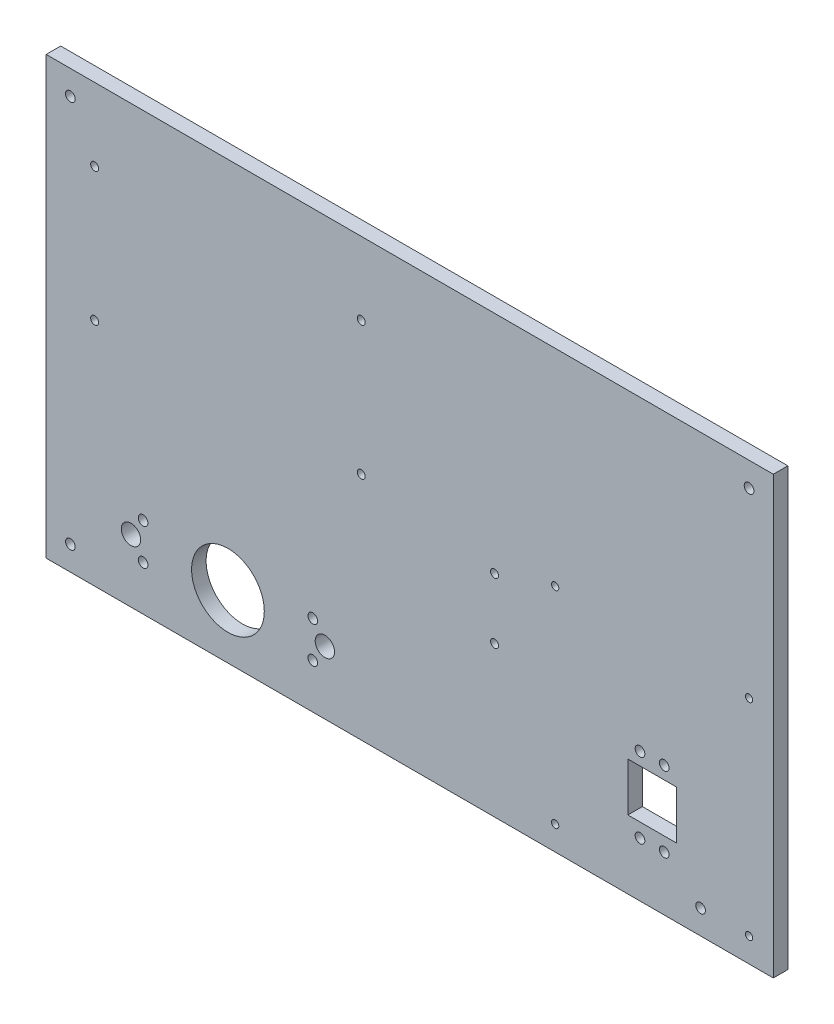
ISO-10303-21;
HEADER;
FILE_DESCRIPTION(('STEP AP214'),'2;1');
FILE_NAME('part.step','',(''),(''),'','','');
FILE_SCHEMA(('AUTOMOTIVE_DESIGN { 1 0 10303 214 1 1 1 1 }'));
ENDSEC;
DATA;
#1=APPLICATION_CONTEXT('core data for automotive mechanical design processes');
#2=APPLICATION_PROTOCOL_DEFINITION('international standard','automotive_design',2000,#1);
#3=PRODUCT_CONTEXT('',#1,'mechanical');
#4=PRODUCT('Part','Part','',(#3));
#5=PRODUCT_RELATED_PRODUCT_CATEGORY('part','',(#4));
#6=PRODUCT_DEFINITION_FORMATION('','',#4);
#7=PRODUCT_DEFINITION_CONTEXT('part definition',#1,'design');
#8=PRODUCT_DEFINITION('design','',#6,#7);
#9=PRODUCT_DEFINITION_SHAPE('','',#8);
#10=(LENGTH_UNIT() NAMED_UNIT(*) SI_UNIT(.MILLI.,.METRE.));
#11=(NAMED_UNIT(*) PLANE_ANGLE_UNIT() SI_UNIT($,.RADIAN.));
#12=(NAMED_UNIT(*) SI_UNIT($,.STERADIAN.) SOLID_ANGLE_UNIT());
#13=UNCERTAINTY_MEASURE_WITH_UNIT(LENGTH_MEASURE(1.E-05),#10,'distance_accuracy_value','');
#14=(GEOMETRIC_REPRESENTATION_CONTEXT(3) GLOBAL_UNCERTAINTY_ASSIGNED_CONTEXT((#13)) GLOBAL_UNIT_ASSIGNED_CONTEXT((#10,
#11,#12)) REPRESENTATION_CONTEXT('',''));
#15=CARTESIAN_POINT('',(0.,0.,0.));
#16=DIRECTION('',(0.,0.,1.));
#17=DIRECTION('',(1.,0.,0.));
#18=AXIS2_PLACEMENT_3D('',#15,#16,#17);
#19=CARTESIAN_POINT('',(0.,-41.75,6.));
#20=DIRECTION('',(0.,1.,0.));
#21=DIRECTION('',(0.,0.,1.));
#22=AXIS2_PLACEMENT_3D('',#19,#20,#21);
#23=PLANE('',#22);
#24=DIRECTION('',(1.,0.,0.));
#25=VECTOR('',#24,1.);
#26=CARTESIAN_POINT('',(0.,-41.75,0.));
#27=LINE('',#26,#25);
#28=CARTESIAN_POINT('',(90.,-41.75,0.));
#29=VERTEX_POINT('',#28);
#30=CARTESIAN_POINT('',(110.,-41.75,0.));
#31=VERTEX_POINT('',#30);
#32=EDGE_CURVE('E199',#29,#31,#27,.T.);
#33=ORIENTED_EDGE('',*,*,#32,.T.);
#34=DIRECTION('',(0.,0.,-1.));
#35=VECTOR('',#34,1.);
#36=CARTESIAN_POINT('',(110.,-41.75,6.));
#37=LINE('',#36,#35);
#38=CARTESIAN_POINT('',(110.,-41.75,6.));
#39=VERTEX_POINT('',#38);
#40=EDGE_CURVE('E11',#39,#31,#37,.T.);
#41=ORIENTED_EDGE('',*,*,#40,.F.);
#42=DIRECTION('',(1.,0.,0.));
#43=VECTOR('',#42,1.);
#44=CARTESIAN_POINT('',(0.,-41.75,6.));
#45=LINE('',#44,#43);
#46=CARTESIAN_POINT('',(90.,-41.75,6.));
#47=VERTEX_POINT('',#46);
#48=EDGE_CURVE('E118',#47,#39,#45,.T.);
#49=ORIENTED_EDGE('',*,*,#48,.F.);
#50=DIRECTION('',(0.,0.,-1.));
#51=VECTOR('',#50,1.);
#52=CARTESIAN_POINT('',(90.,-41.75,6.));
#53=LINE('',#52,#51);
#54=EDGE_CURVE('E56',#47,#29,#53,.T.);
#55=ORIENTED_EDGE('',*,*,#54,.T.);
#56=EDGE_LOOP('',(#33,#41,#49,#55));
#57=FACE_BOUND('',#56,.T.);
#58=ADVANCED_FACE('F37',(#57),#23,.F.);
#59=CARTESIAN_POINT('',(110.,0.,6.));
#60=DIRECTION('',(1.,0.,0.));
#61=DIRECTION('',(0.,1.,0.));
#62=AXIS2_PLACEMENT_3D('',#59,#60,#61);
#63=PLANE('',#62);
#64=DIRECTION('',(0.,-1.,0.));
#65=VECTOR('',#64,1.);
#66=CARTESIAN_POINT('',(110.,0.,0.));
#67=LINE('',#66,#65);
#68=CARTESIAN_POINT('',(110.,-61.75,0.));
#69=VERTEX_POINT('',#68);
#70=EDGE_CURVE('E124',#31,#69,#67,.T.);
#71=ORIENTED_EDGE('',*,*,#70,.T.);
#72=DIRECTION('',(0.,0.,-1.));
#73=VECTOR('',#72,1.);
#74=CARTESIAN_POINT('',(110.,-61.75,6.));
#75=LINE('',#74,#73);
#76=CARTESIAN_POINT('',(110.,-61.75,6.));
#77=VERTEX_POINT('',#76);
#78=EDGE_CURVE('E47',#77,#69,#75,.T.);
#79=ORIENTED_EDGE('',*,*,#78,.F.);
#80=DIRECTION('',(0.,-1.,0.));
#81=VECTOR('',#80,1.);
#82=CARTESIAN_POINT('',(110.,0.,6.));
#83=LINE('',#82,#81);
#84=EDGE_CURVE('E111',#39,#77,#83,.T.);
#85=ORIENTED_EDGE('',*,*,#84,.F.);
#86=ORIENTED_EDGE('',*,*,#40,.T.);
#87=EDGE_LOOP('',(#71,#79,#85,#86));
#88=FACE_BOUND('',#87,.T.);
#89=ADVANCED_FACE('F123',(#88),#63,.F.);
#90=CARTESIAN_POINT('',(0.,-61.75,6.));
#91=DIRECTION('',(0.,1.,0.));
#92=DIRECTION('',(0.,0.,1.));
#93=AXIS2_PLACEMENT_3D('',#90,#91,#92);
#94=PLANE('',#93);
#95=DIRECTION('',(1.,0.,0.));
#96=VECTOR('',#95,1.);
#97=CARTESIAN_POINT('',(0.,-61.75,0.));
#98=LINE('',#97,#96);
#99=CARTESIAN_POINT('',(90.,-61.75,0.));
#100=VERTEX_POINT('',#99);
#101=EDGE_CURVE('E202',#100,#69,#98,.T.);
#102=ORIENTED_EDGE('',*,*,#101,.F.);
#103=DIRECTION('',(0.,0.,-1.));
#104=VECTOR('',#103,1.);
#105=CARTESIAN_POINT('',(90.,-61.75,6.));
#106=LINE('',#105,#104);
#107=CARTESIAN_POINT('',(90.,-61.75,6.));
#108=VERTEX_POINT('',#107);
#109=EDGE_CURVE('E82',#108,#100,#106,.T.);
#110=ORIENTED_EDGE('',*,*,#109,.F.);
#111=DIRECTION('',(1.,0.,0.));
#112=VECTOR('',#111,1.);
#113=CARTESIAN_POINT('',(0.,-61.75,6.));
#114=LINE('',#113,#112);
#115=EDGE_CURVE('E117',#108,#77,#114,.T.);
#116=ORIENTED_EDGE('',*,*,#115,.T.);
#117=ORIENTED_EDGE('',*,*,#78,.T.);
#118=EDGE_LOOP('',(#102,#110,#116,#117));
#119=FACE_BOUND('',#118,.T.);
#120=ADVANCED_FACE('F128',(#119),#94,.T.);
#121=CARTESIAN_POINT('',(150.,0.,6.));
#122=DIRECTION('',(1.,0.,0.));
#123=DIRECTION('',(0.,1.,0.));
#124=AXIS2_PLACEMENT_3D('',#121,#122,#123);
#125=PLANE('',#124);
#126=DIRECTION('',(0.,-1.,0.));
#127=VECTOR('',#126,1.);
#128=CARTESIAN_POINT('',(150.,0.,0.));
#129=LINE('',#128,#127);
#130=CARTESIAN_POINT('',(150.,89.9999999999999,0.));
#131=VERTEX_POINT('',#130);
#132=CARTESIAN_POINT('',(150.,-89.9999999999999,0.));
#133=VERTEX_POINT('',#132);
#134=EDGE_CURVE('E187',#131,#133,#129,.T.);
#135=ORIENTED_EDGE('',*,*,#134,.F.);
#136=DIRECTION('',(0.,0.,-1.));
#137=VECTOR('',#136,1.);
#138=CARTESIAN_POINT('',(150.,89.9999999999999,6.));
#139=LINE('',#138,#137);
#140=CARTESIAN_POINT('',(150.,89.9999999999999,6.));
#141=VERTEX_POINT('',#140);
#142=EDGE_CURVE('E94',#141,#131,#139,.T.);
#143=ORIENTED_EDGE('',*,*,#142,.F.);
#144=DIRECTION('',(0.,-1.,0.));
#145=VECTOR('',#144,1.);
#146=CARTESIAN_POINT('',(150.,0.,6.));
#147=LINE('',#146,#145);
#148=CARTESIAN_POINT('',(150.,-89.9999999999999,6.));
#149=VERTEX_POINT('',#148);
#150=EDGE_CURVE('E312',#141,#149,#147,.T.);
#151=ORIENTED_EDGE('',*,*,#150,.T.);
#152=DIRECTION('',(0.,0.,-1.));
#153=VECTOR('',#152,1.);
#154=CARTESIAN_POINT('',(150.,-89.9999999999999,6.));
#155=LINE('',#154,#153);
#156=EDGE_CURVE('E137',#149,#133,#155,.T.);
#157=ORIENTED_EDGE('',*,*,#156,.T.);
#158=EDGE_LOOP('',(#135,#143,#151,#157));
#159=FACE_BOUND('',#158,.T.);
#160=ADVANCED_FACE('F328',(#159),#125,.T.);
#161=CARTESIAN_POINT('',(0.,90.,6.));
#162=DIRECTION('',(0.,1.,0.));
#163=DIRECTION('',(-1.,0.,0.));
#164=AXIS2_PLACEMENT_3D('',#161,#162,#163);
#165=PLANE('',#164);
#166=DIRECTION('',(1.,0.,0.));
#167=VECTOR('',#166,1.);
#168=CARTESIAN_POINT('',(0.,90.,0.));
#169=LINE('',#168,#167);
#170=CARTESIAN_POINT('',(-150.,90.,0.));
#171=VERTEX_POINT('',#170);
#172=EDGE_CURVE('E190',#171,#131,#169,.T.);
#173=ORIENTED_EDGE('',*,*,#172,.F.);
#174=DIRECTION('',(0.,0.,-1.));
#175=VECTOR('',#174,1.);
#176=CARTESIAN_POINT('',(-150.,90.,6.));
#177=LINE('',#176,#175);
#178=CARTESIAN_POINT('',(-150.,90.,6.));
#179=VERTEX_POINT('',#178);
#180=EDGE_CURVE('E217',#179,#171,#177,.T.);
#181=ORIENTED_EDGE('',*,*,#180,.F.);
#182=DIRECTION('',(1.,0.,0.));
#183=VECTOR('',#182,1.);
#184=CARTESIAN_POINT('',(0.,90.,6.));
#185=LINE('',#184,#183);
#186=EDGE_CURVE('E314',#179,#141,#185,.T.);
#187=ORIENTED_EDGE('',*,*,#186,.T.);
#188=ORIENTED_EDGE('',*,*,#142,.T.);
#189=EDGE_LOOP('',(#173,#181,#187,#188));
#190=FACE_BOUND('',#189,.T.);
#191=ADVANCED_FACE('F330',(#190),#165,.T.);
#192=CARTESIAN_POINT('',(-150.,0.,6.));
#193=DIRECTION('',(1.,0.,0.));
#194=DIRECTION('',(0.,1.,0.));
#195=AXIS2_PLACEMENT_3D('',#192,#193,#194);
#196=PLANE('',#195);
#197=DIRECTION('',(0.,-1.,0.));
#198=VECTOR('',#197,1.);
#199=CARTESIAN_POINT('',(-150.,0.,0.));
#200=LINE('',#199,#198);
#201=CARTESIAN_POINT('',(-150.,-90.,0.));
#202=VERTEX_POINT('',#201);
#203=EDGE_CURVE('E193',#171,#202,#200,.T.);
#204=ORIENTED_EDGE('',*,*,#203,.T.);
#205=DIRECTION('',(0.,0.,-1.));
#206=VECTOR('',#205,1.);
#207=CARTESIAN_POINT('',(-150.,-90.,6.));
#208=LINE('',#207,#206);
#209=CARTESIAN_POINT('',(-150.,-90.,6.));
#210=VERTEX_POINT('',#209);
#211=EDGE_CURVE('E214',#210,#202,#208,.T.);
#212=ORIENTED_EDGE('',*,*,#211,.F.);
#213=DIRECTION('',(0.,-1.,0.));
#214=VECTOR('',#213,1.);
#215=CARTESIAN_POINT('',(-150.,0.,6.));
#216=LINE('',#215,#214);
#217=EDGE_CURVE('E317',#179,#210,#216,.T.);
#218=ORIENTED_EDGE('',*,*,#217,.F.);
#219=ORIENTED_EDGE('',*,*,#180,.T.);
#220=EDGE_LOOP('',(#204,#212,#218,#219));
#221=FACE_BOUND('',#220,.T.);
#222=ADVANCED_FACE('F336',(#221),#196,.F.);
#223=CARTESIAN_POINT('',(90.,0.,6.));
#224=DIRECTION('',(1.,0.,0.));
#225=DIRECTION('',(0.,0.,-1.));
#226=AXIS2_PLACEMENT_3D('',#223,#224,#225);
#227=PLANE('',#226);
#228=DIRECTION('',(0.,-1.,0.));
#229=VECTOR('',#228,1.);
#230=CARTESIAN_POINT('',(90.,0.,0.));
#231=LINE('',#230,#229);
#232=EDGE_CURVE('E204',#29,#100,#231,.T.);
#233=ORIENTED_EDGE('',*,*,#232,.F.);
#234=ORIENTED_EDGE('',*,*,#54,.F.);
#235=DIRECTION('',(0.,-1.,0.));
#236=VECTOR('',#235,1.);
#237=CARTESIAN_POINT('',(90.,0.,6.));
#238=LINE('',#237,#236);
#239=EDGE_CURVE('E129',#47,#108,#238,.T.);
#240=ORIENTED_EDGE('',*,*,#239,.T.);
#241=ORIENTED_EDGE('',*,*,#109,.T.);
#242=EDGE_LOOP('',(#233,#234,#240,#241));
#243=FACE_BOUND('',#242,.T.);
#244=ADVANCED_FACE('F351',(#243),#227,.T.);
#245=CARTESIAN_POINT('',(0.,-90.,6.));
#246=DIRECTION('',(0.,1.,0.));
#247=DIRECTION('',(-1.,0.,0.));
#248=AXIS2_PLACEMENT_3D('',#245,#246,#247);
#249=PLANE('',#248);
#250=DIRECTION('',(1.,0.,0.));
#251=VECTOR('',#250,1.);
#252=CARTESIAN_POINT('',(0.,-90.,0.));
#253=LINE('',#252,#251);
#254=EDGE_CURVE('E196',#202,#133,#253,.T.);
#255=ORIENTED_EDGE('',*,*,#254,.T.);
#256=ORIENTED_EDGE('',*,*,#156,.F.);
#257=DIRECTION('',(1.,0.,0.));
#258=VECTOR('',#257,1.);
#259=CARTESIAN_POINT('',(0.,-90.,6.));
#260=LINE('',#259,#258);
#261=EDGE_CURVE('E320',#210,#149,#260,.T.);
#262=ORIENTED_EDGE('',*,*,#261,.F.);
#263=ORIENTED_EDGE('',*,*,#211,.T.);
#264=EDGE_LOOP('',(#255,#256,#262,#263));
#265=FACE_BOUND('',#264,.T.);
#266=ADVANCED_FACE('F327',(#265),#249,.F.);
#267=CARTESIAN_POINT('',(140.,4.99999999999997,6.));
#268=DIRECTION('',(0.,0.,-1.));
#269=DIRECTION('',(-1.,0.,0.));
#270=AXIS2_PLACEMENT_3D('',#267,#268,#269);
#271=CYLINDRICAL_SURFACE('',#270,1.5);
#272=CARTESIAN_POINT('',(140.,4.99999999999997,6.));
#273=DIRECTION('',(0.,0.,1.));
#274=DIRECTION('',(1.,0.,0.));
#275=AXIS2_PLACEMENT_3D('',#272,#273,#274);
#276=CIRCLE('',#275,1.5);
#277=CARTESIAN_POINT('',(141.5,4.99999999999997,6.));
#278=VERTEX_POINT('',#277);
#279=EDGE_CURVE('E309',#278,#278,#276,.T.);
#280=ORIENTED_EDGE('',*,*,#279,.T.);
#281=EDGE_LOOP('',(#280));
#282=FACE_BOUND('',#281,.T.);
#283=CARTESIAN_POINT('',(140.,4.99999999999997,0.));
#284=DIRECTION('',(0.,0.,1.));
#285=DIRECTION('',(1.,0.,0.));
#286=AXIS2_PLACEMENT_3D('',#283,#284,#285);
#287=CIRCLE('',#286,1.5);
#288=CARTESIAN_POINT('',(141.5,4.99999999999997,0.));
#289=VERTEX_POINT('',#288);
#290=EDGE_CURVE('E184',#289,#289,#287,.T.);
#291=ORIENTED_EDGE('',*,*,#290,.F.);
#292=EDGE_LOOP('',(#291));
#293=FACE_BOUND('',#292,.T.);
#294=ADVANCED_FACE('F350',(#282,#293),#271,.F.);
#295=CARTESIAN_POINT('',(140.,-80.,6.));
#296=DIRECTION('',(0.,0.,-1.));
#297=DIRECTION('',(-1.,0.,0.));
#298=AXIS2_PLACEMENT_3D('',#295,#296,#297);
#299=CYLINDRICAL_SURFACE('',#298,1.5);
#300=CARTESIAN_POINT('',(140.,-80.,6.));
#301=DIRECTION('',(0.,0.,1.));
#302=DIRECTION('',(1.,0.,0.));
#303=AXIS2_PLACEMENT_3D('',#300,#301,#302);
#304=CIRCLE('',#303,1.5);
#305=CARTESIAN_POINT('',(141.5,-80.,6.));
#306=VERTEX_POINT('',#305);
#307=EDGE_CURVE('E306',#306,#306,#304,.F.);
#308=ORIENTED_EDGE('',*,*,#307,.F.);
#309=EDGE_LOOP('',(#308));
#310=FACE_BOUND('',#309,.T.);
#311=CARTESIAN_POINT('',(140.,-80.,0.));
#312=DIRECTION('',(0.,0.,1.));
#313=DIRECTION('',(1.,0.,0.));
#314=AXIS2_PLACEMENT_3D('',#311,#312,#313);
#315=CIRCLE('',#314,1.5);
#316=CARTESIAN_POINT('',(141.5,-80.,0.));
#317=VERTEX_POINT('',#316);
#318=EDGE_CURVE('E181',#317,#317,#315,.F.);
#319=ORIENTED_EDGE('',*,*,#318,.T.);
#320=EDGE_LOOP('',(#319));
#321=FACE_BOUND('',#320,.T.);
#322=ADVANCED_FACE('F469',(#310,#321),#299,.F.);
#323=CARTESIAN_POINT('',(60.,4.99999999999995,6.));
#324=DIRECTION('',(0.,0.,-1.));
#325=DIRECTION('',(-1.,0.,0.));
#326=AXIS2_PLACEMENT_3D('',#323,#324,#325);
#327=CYLINDRICAL_SURFACE('',#326,1.5);
#328=CARTESIAN_POINT('',(60.,4.99999999999995,6.));
#329=DIRECTION('',(0.,0.,1.));
#330=DIRECTION('',(1.,0.,0.));
#331=AXIS2_PLACEMENT_3D('',#328,#329,#330);
#332=CIRCLE('',#331,1.5);
#333=CARTESIAN_POINT('',(61.5,4.99999999999995,6.));
#334=VERTEX_POINT('',#333);
#335=EDGE_CURVE('E303',#334,#334,#332,.T.);
#336=ORIENTED_EDGE('',*,*,#335,.T.);
#337=EDGE_LOOP('',(#336));
#338=FACE_BOUND('',#337,.T.);
#339=CARTESIAN_POINT('',(60.,4.99999999999995,0.));
#340=DIRECTION('',(0.,0.,1.));
#341=DIRECTION('',(1.,0.,0.));
#342=AXIS2_PLACEMENT_3D('',#339,#340,#341);
#343=CIRCLE('',#342,1.5);
#344=CARTESIAN_POINT('',(61.5,4.99999999999995,0.));
#345=VERTEX_POINT('',#344);
#346=EDGE_CURVE('E178',#345,#345,#343,.T.);
#347=ORIENTED_EDGE('',*,*,#346,.F.);
#348=EDGE_LOOP('',(#347));
#349=FACE_BOUND('',#348,.T.);
#350=ADVANCED_FACE('F475',(#338,#349),#327,.F.);
#351=CARTESIAN_POINT('',(-110.,-56.5,6.));
#352=DIRECTION('',(0.,0.,-1.));
#353=DIRECTION('',(-1.,0.,0.));
#354=AXIS2_PLACEMENT_3D('',#351,#352,#353);
#355=CYLINDRICAL_SURFACE('',#354,2.);
#356=CARTESIAN_POINT('',(-110.,-56.5,6.));
#357=DIRECTION('',(0.,0.,1.));
#358=DIRECTION('',(1.,0.,0.));
#359=AXIS2_PLACEMENT_3D('',#356,#357,#358);
#360=CIRCLE('',#359,2.);
#361=CARTESIAN_POINT('',(-108.,-56.5,6.));
#362=VERTEX_POINT('',#361);
#363=EDGE_CURVE('E300',#362,#362,#360,.T.);
#364=ORIENTED_EDGE('',*,*,#363,.T.);
#365=EDGE_LOOP('',(#364));
#366=FACE_BOUND('',#365,.T.);
#367=CARTESIAN_POINT('',(-110.,-56.5,0.));
#368=DIRECTION('',(0.,0.,1.));
#369=DIRECTION('',(1.,0.,0.));
#370=AXIS2_PLACEMENT_3D('',#367,#368,#369);
#371=CIRCLE('',#370,2.);
#372=CARTESIAN_POINT('',(-108.,-56.5,0.));
#373=VERTEX_POINT('',#372);
#374=EDGE_CURVE('E175',#373,#373,#371,.T.);
#375=ORIENTED_EDGE('',*,*,#374,.F.);
#376=EDGE_LOOP('',(#375));
#377=FACE_BOUND('',#376,.T.);
#378=ADVANCED_FACE('F481',(#366,#377),#355,.F.);
#379=CARTESIAN_POINT('',(-39.9999999999999,-56.5,6.));
#380=DIRECTION('',(0.,0.,-1.));
#381=DIRECTION('',(-1.,0.,0.));
#382=AXIS2_PLACEMENT_3D('',#379,#380,#381);
#383=CYLINDRICAL_SURFACE('',#382,2.);
#384=CARTESIAN_POINT('',(-39.9999999999999,-56.5,6.));
#385=DIRECTION('',(0.,0.,1.));
#386=DIRECTION('',(1.,0.,0.));
#387=AXIS2_PLACEMENT_3D('',#384,#385,#386);
#388=CIRCLE('',#387,2.);
#389=CARTESIAN_POINT('',(-37.9999999999999,-56.5,6.));
#390=VERTEX_POINT('',#389);
#391=EDGE_CURVE('E297',#390,#390,#388,.T.);
#392=ORIENTED_EDGE('',*,*,#391,.T.);
#393=EDGE_LOOP('',(#392));
#394=FACE_BOUND('',#393,.T.);
#395=CARTESIAN_POINT('',(-39.9999999999999,-56.5,0.));
#396=DIRECTION('',(0.,0.,1.));
#397=DIRECTION('',(1.,0.,0.));
#398=AXIS2_PLACEMENT_3D('',#395,#396,#397);
#399=CIRCLE('',#398,2.);
#400=CARTESIAN_POINT('',(-37.9999999999999,-56.5,0.));
#401=VERTEX_POINT('',#400);
#402=EDGE_CURVE('E172',#401,#401,#399,.T.);
#403=ORIENTED_EDGE('',*,*,#402,.F.);
#404=EDGE_LOOP('',(#403));
#405=FACE_BOUND('',#404,.T.);
#406=ADVANCED_FACE('F485',(#394,#405),#383,.F.);
#407=CARTESIAN_POINT('',(-74.9999999999999,-64.,6.));
#408=DIRECTION('',(0.,0.,-1.));
#409=DIRECTION('',(-1.,0.,0.));
#410=AXIS2_PLACEMENT_3D('',#407,#408,#409);
#411=CYLINDRICAL_SURFACE('',#410,15.);
#412=CARTESIAN_POINT('',(-74.9999999999999,-64.,6.));
#413=DIRECTION('',(0.,0.,1.));
#414=DIRECTION('',(1.,0.,0.));
#415=AXIS2_PLACEMENT_3D('',#412,#413,#414);
#416=CIRCLE('',#415,15.);
#417=CARTESIAN_POINT('',(-59.9999999999999,-64.,6.));
#418=VERTEX_POINT('',#417);
#419=EDGE_CURVE('E294',#418,#418,#416,.T.);
#420=ORIENTED_EDGE('',*,*,#419,.T.);
#421=EDGE_LOOP('',(#420));
#422=FACE_BOUND('',#421,.T.);
#423=CARTESIAN_POINT('',(-74.9999999999999,-64.,0.));
#424=DIRECTION('',(0.,0.,1.));
#425=DIRECTION('',(1.,0.,0.));
#426=AXIS2_PLACEMENT_3D('',#423,#424,#425);
#427=CIRCLE('',#426,15.);
#428=CARTESIAN_POINT('',(-59.9999999999999,-64.,0.));
#429=VERTEX_POINT('',#428);
#430=EDGE_CURVE('E169',#429,#429,#427,.T.);
#431=ORIENTED_EDGE('',*,*,#430,.F.);
#432=EDGE_LOOP('',(#431));
#433=FACE_BOUND('',#432,.T.);
#434=ADVANCED_FACE('F489',(#422,#433),#411,.F.);
#435=CARTESIAN_POINT('',(-34.9999999999999,-64.,6.));
#436=DIRECTION('',(0.,0.,-1.));
#437=DIRECTION('',(-1.,0.,0.));
#438=AXIS2_PLACEMENT_3D('',#435,#436,#437);
#439=CYLINDRICAL_SURFACE('',#438,4.);
#440=CARTESIAN_POINT('',(-34.9999999999999,-64.,6.));
#441=DIRECTION('',(0.,0.,1.));
#442=DIRECTION('',(1.,0.,0.));
#443=AXIS2_PLACEMENT_3D('',#440,#441,#442);
#444=CIRCLE('',#443,4.);
#445=CARTESIAN_POINT('',(-30.9999999999999,-64.,6.));
#446=VERTEX_POINT('',#445);
#447=EDGE_CURVE('E291',#446,#446,#444,.T.);
#448=ORIENTED_EDGE('',*,*,#447,.T.);
#449=EDGE_LOOP('',(#448));
#450=FACE_BOUND('',#449,.T.);
#451=CARTESIAN_POINT('',(-34.9999999999999,-64.,0.));
#452=DIRECTION('',(0.,0.,1.));
#453=DIRECTION('',(1.,0.,0.));
#454=AXIS2_PLACEMENT_3D('',#451,#452,#453);
#455=CIRCLE('',#454,4.);
#456=CARTESIAN_POINT('',(-30.9999999999999,-64.,0.));
#457=VERTEX_POINT('',#456);
#458=EDGE_CURVE('E166',#457,#457,#455,.T.);
#459=ORIENTED_EDGE('',*,*,#458,.F.);
#460=EDGE_LOOP('',(#459));
#461=FACE_BOUND('',#460,.T.);
#462=ADVANCED_FACE('F493',(#450,#461),#439,.F.);
#463=CARTESIAN_POINT('',(-115.,-64.0000000000001,6.));
#464=DIRECTION('',(0.,0.,-1.));
#465=DIRECTION('',(-1.,0.,0.));
#466=AXIS2_PLACEMENT_3D('',#463,#464,#465);
#467=CYLINDRICAL_SURFACE('',#466,4.00000000000001);
#468=CARTESIAN_POINT('',(-115.,-64.0000000000001,6.));
#469=DIRECTION('',(0.,0.,1.));
#470=DIRECTION('',(1.,0.,0.));
#471=AXIS2_PLACEMENT_3D('',#468,#469,#470);
#472=CIRCLE('',#471,4.00000000000001);
#473=CARTESIAN_POINT('',(-111.,-64.0000000000001,6.));
#474=VERTEX_POINT('',#473);
#475=EDGE_CURVE('E288',#474,#474,#472,.T.);
#476=ORIENTED_EDGE('',*,*,#475,.T.);
#477=EDGE_LOOP('',(#476));
#478=FACE_BOUND('',#477,.T.);
#479=CARTESIAN_POINT('',(-115.,-64.0000000000001,0.));
#480=DIRECTION('',(0.,0.,1.));
#481=DIRECTION('',(1.,0.,0.));
#482=AXIS2_PLACEMENT_3D('',#479,#480,#481);
#483=CIRCLE('',#482,4.00000000000001);
#484=CARTESIAN_POINT('',(-111.,-64.0000000000001,0.));
#485=VERTEX_POINT('',#484);
#486=EDGE_CURVE('E163',#485,#485,#483,.T.);
#487=ORIENTED_EDGE('',*,*,#486,.F.);
#488=EDGE_LOOP('',(#487));
#489=FACE_BOUND('',#488,.T.);
#490=ADVANCED_FACE('F497',(#478,#489),#467,.F.);
#491=CARTESIAN_POINT('',(-39.9999999999999,-71.5,6.));
#492=DIRECTION('',(0.,0.,-1.));
#493=DIRECTION('',(-1.,0.,0.));
#494=AXIS2_PLACEMENT_3D('',#491,#492,#493);
#495=CYLINDRICAL_SURFACE('',#494,2.);
#496=CARTESIAN_POINT('',(-39.9999999999999,-71.5,6.));
#497=DIRECTION('',(0.,0.,1.));
#498=DIRECTION('',(1.,0.,0.));
#499=AXIS2_PLACEMENT_3D('',#496,#497,#498);
#500=CIRCLE('',#499,2.);
#501=CARTESIAN_POINT('',(-37.9999999999999,-71.5,6.));
#502=VERTEX_POINT('',#501);
#503=EDGE_CURVE('E285',#502,#502,#500,.T.);
#504=ORIENTED_EDGE('',*,*,#503,.T.);
#505=EDGE_LOOP('',(#504));
#506=FACE_BOUND('',#505,.T.);
#507=CARTESIAN_POINT('',(-39.9999999999999,-71.5,0.));
#508=DIRECTION('',(0.,0.,1.));
#509=DIRECTION('',(1.,0.,0.));
#510=AXIS2_PLACEMENT_3D('',#507,#508,#509);
#511=CIRCLE('',#510,2.);
#512=CARTESIAN_POINT('',(-37.9999999999999,-71.5,0.));
#513=VERTEX_POINT('',#512);
#514=EDGE_CURVE('E160',#513,#513,#511,.T.);
#515=ORIENTED_EDGE('',*,*,#514,.F.);
#516=EDGE_LOOP('',(#515));
#517=FACE_BOUND('',#516,.T.);
#518=ADVANCED_FACE('F501',(#506,#517),#495,.F.);
#519=CARTESIAN_POINT('',(-110.,-71.5,6.));
#520=DIRECTION('',(0.,0.,-1.));
#521=DIRECTION('',(-1.,0.,0.));
#522=AXIS2_PLACEMENT_3D('',#519,#520,#521);
#523=CYLINDRICAL_SURFACE('',#522,2.);
#524=CARTESIAN_POINT('',(-110.,-71.5,6.));
#525=DIRECTION('',(0.,0.,1.));
#526=DIRECTION('',(1.,0.,0.));
#527=AXIS2_PLACEMENT_3D('',#524,#525,#526);
#528=CIRCLE('',#527,2.);
#529=CARTESIAN_POINT('',(-108.,-71.5,6.));
#530=VERTEX_POINT('',#529);
#531=EDGE_CURVE('E282',#530,#530,#528,.T.);
#532=ORIENTED_EDGE('',*,*,#531,.T.);
#533=EDGE_LOOP('',(#532));
#534=FACE_BOUND('',#533,.T.);
#535=CARTESIAN_POINT('',(-110.,-71.5,0.));
#536=DIRECTION('',(0.,0.,1.));
#537=DIRECTION('',(1.,0.,0.));
#538=AXIS2_PLACEMENT_3D('',#535,#536,#537);
#539=CIRCLE('',#538,2.);
#540=CARTESIAN_POINT('',(-108.,-71.5,0.));
#541=VERTEX_POINT('',#540);
#542=EDGE_CURVE('E157',#541,#541,#539,.T.);
#543=ORIENTED_EDGE('',*,*,#542,.F.);
#544=EDGE_LOOP('',(#543));
#545=FACE_BOUND('',#544,.T.);
#546=ADVANCED_FACE('F505',(#534,#545),#523,.F.);
#547=CARTESIAN_POINT('',(35.,-3.00000000000004,6.));
#548=DIRECTION('',(0.,0.,-1.));
#549=DIRECTION('',(-1.,0.,0.));
#550=AXIS2_PLACEMENT_3D('',#547,#548,#549);
#551=CYLINDRICAL_SURFACE('',#550,1.65);
#552=CARTESIAN_POINT('',(35.,-3.00000000000004,6.));
#553=DIRECTION('',(0.,0.,1.));
#554=DIRECTION('',(1.,0.,0.));
#555=AXIS2_PLACEMENT_3D('',#552,#553,#554);
#556=CIRCLE('',#555,1.65);
#557=CARTESIAN_POINT('',(36.65,-3.00000000000004,6.));
#558=VERTEX_POINT('',#557);
#559=EDGE_CURVE('E279',#558,#558,#556,.T.);
#560=ORIENTED_EDGE('',*,*,#559,.T.);
#561=EDGE_LOOP('',(#560));
#562=FACE_BOUND('',#561,.T.);
#563=CARTESIAN_POINT('',(35.,-3.00000000000004,0.));
#564=DIRECTION('',(0.,0.,1.));
#565=DIRECTION('',(1.,0.,0.));
#566=AXIS2_PLACEMENT_3D('',#563,#564,#565);
#567=CIRCLE('',#566,1.65);
#568=CARTESIAN_POINT('',(36.65,-3.00000000000004,0.));
#569=VERTEX_POINT('',#568);
#570=EDGE_CURVE('E154',#569,#569,#567,.T.);
#571=ORIENTED_EDGE('',*,*,#570,.F.);
#572=EDGE_LOOP('',(#571));
#573=FACE_BOUND('',#572,.T.);
#574=ADVANCED_FACE('F509',(#562,#573),#551,.F.);
#575=CARTESIAN_POINT('',(35.,-28.,6.));
#576=DIRECTION('',(0.,0.,-1.));
#577=DIRECTION('',(-1.,0.,0.));
#578=AXIS2_PLACEMENT_3D('',#575,#576,#577);
#579=CYLINDRICAL_SURFACE('',#578,1.65);
#580=CARTESIAN_POINT('',(35.,-28.,6.));
#581=DIRECTION('',(0.,0.,1.));
#582=DIRECTION('',(1.,0.,0.));
#583=AXIS2_PLACEMENT_3D('',#580,#581,#582);
#584=CIRCLE('',#583,1.65);
#585=CARTESIAN_POINT('',(36.65,-28.,6.));
#586=VERTEX_POINT('',#585);
#587=EDGE_CURVE('E276',#586,#586,#584,.T.);
#588=ORIENTED_EDGE('',*,*,#587,.T.);
#589=EDGE_LOOP('',(#588));
#590=FACE_BOUND('',#589,.T.);
#591=CARTESIAN_POINT('',(35.,-28.,0.));
#592=DIRECTION('',(0.,0.,1.));
#593=DIRECTION('',(1.,0.,0.));
#594=AXIS2_PLACEMENT_3D('',#591,#592,#593);
#595=CIRCLE('',#594,1.65);
#596=CARTESIAN_POINT('',(36.65,-28.,0.));
#597=VERTEX_POINT('',#596);
#598=EDGE_CURVE('E151',#597,#597,#595,.T.);
#599=ORIENTED_EDGE('',*,*,#598,.F.);
#600=EDGE_LOOP('',(#599));
#601=FACE_BOUND('',#600,.T.);
#602=ADVANCED_FACE('F513',(#590,#601),#579,.F.);
#603=CARTESIAN_POINT('',(-130.,59.9999999999999,6.));
#604=DIRECTION('',(0.,0.,-1.));
#605=DIRECTION('',(-1.,0.,0.));
#606=AXIS2_PLACEMENT_3D('',#603,#604,#605);
#607=CYLINDRICAL_SURFACE('',#606,1.64999999999999);
#608=CARTESIAN_POINT('',(-130.,59.9999999999999,6.));
#609=DIRECTION('',(0.,0.,1.));
#610=DIRECTION('',(1.,0.,0.));
#611=AXIS2_PLACEMENT_3D('',#608,#609,#610);
#612=CIRCLE('',#611,1.64999999999999);
#613=CARTESIAN_POINT('',(-128.35,59.9999999999999,6.));
#614=VERTEX_POINT('',#613);
#615=EDGE_CURVE('E273',#614,#614,#612,.T.);
#616=ORIENTED_EDGE('',*,*,#615,.T.);
#617=EDGE_LOOP('',(#616));
#618=FACE_BOUND('',#617,.T.);
#619=CARTESIAN_POINT('',(-130.,59.9999999999999,0.));
#620=DIRECTION('',(0.,0.,1.));
#621=DIRECTION('',(1.,0.,0.));
#622=AXIS2_PLACEMENT_3D('',#619,#620,#621);
#623=CIRCLE('',#622,1.64999999999999);
#624=CARTESIAN_POINT('',(-128.35,59.9999999999999,0.));
#625=VERTEX_POINT('',#624);
#626=EDGE_CURVE('E148',#625,#625,#623,.T.);
#627=ORIENTED_EDGE('',*,*,#626,.F.);
#628=EDGE_LOOP('',(#627));
#629=FACE_BOUND('',#628,.T.);
#630=ADVANCED_FACE('F517',(#618,#629),#607,.F.);
#631=CARTESIAN_POINT('',(-20.,60.,6.));
#632=DIRECTION('',(0.,0.,-1.));
#633=DIRECTION('',(-1.,0.,0.));
#634=AXIS2_PLACEMENT_3D('',#631,#632,#633);
#635=CYLINDRICAL_SURFACE('',#634,1.65000000000001);
#636=CARTESIAN_POINT('',(-20.,60.,6.));
#637=DIRECTION('',(0.,0.,1.));
#638=DIRECTION('',(1.,0.,0.));
#639=AXIS2_PLACEMENT_3D('',#636,#637,#638);
#640=CIRCLE('',#639,1.65000000000001);
#641=CARTESIAN_POINT('',(-18.35,60.,6.));
#642=VERTEX_POINT('',#641);
#643=EDGE_CURVE('E270',#642,#642,#640,.T.);
#644=ORIENTED_EDGE('',*,*,#643,.T.);
#645=EDGE_LOOP('',(#644));
#646=FACE_BOUND('',#645,.T.);
#647=CARTESIAN_POINT('',(-20.,60.,0.));
#648=DIRECTION('',(0.,0.,1.));
#649=DIRECTION('',(1.,0.,0.));
#650=AXIS2_PLACEMENT_3D('',#647,#648,#649);
#651=CIRCLE('',#650,1.65000000000001);
#652=CARTESIAN_POINT('',(-18.35,60.,0.));
#653=VERTEX_POINT('',#652);
#654=EDGE_CURVE('E145',#653,#653,#651,.T.);
#655=ORIENTED_EDGE('',*,*,#654,.F.);
#656=EDGE_LOOP('',(#655));
#657=FACE_BOUND('',#656,.T.);
#658=ADVANCED_FACE('F521',(#646,#657),#635,.F.);
#659=CARTESIAN_POINT('',(-20.,4.99999999999996,6.));
#660=DIRECTION('',(0.,0.,-1.));
#661=DIRECTION('',(-1.,0.,0.));
#662=AXIS2_PLACEMENT_3D('',#659,#660,#661);
#663=CYLINDRICAL_SURFACE('',#662,1.65000000000001);
#664=CARTESIAN_POINT('',(-20.,4.99999999999996,6.));
#665=DIRECTION('',(0.,0.,1.));
#666=DIRECTION('',(1.,0.,0.));
#667=AXIS2_PLACEMENT_3D('',#664,#665,#666);
#668=CIRCLE('',#667,1.65000000000001);
#669=CARTESIAN_POINT('',(-18.35,4.99999999999996,6.));
#670=VERTEX_POINT('',#669);
#671=EDGE_CURVE('E267',#670,#670,#668,.T.);
#672=ORIENTED_EDGE('',*,*,#671,.T.);
#673=EDGE_LOOP('',(#672));
#674=FACE_BOUND('',#673,.T.);
#675=CARTESIAN_POINT('',(-20.,4.99999999999996,0.));
#676=DIRECTION('',(0.,0.,1.));
#677=DIRECTION('',(1.,0.,0.));
#678=AXIS2_PLACEMENT_3D('',#675,#676,#677);
#679=CIRCLE('',#678,1.65000000000001);
#680=CARTESIAN_POINT('',(-18.35,4.99999999999996,0.));
#681=VERTEX_POINT('',#680);
#682=EDGE_CURVE('E141',#681,#681,#679,.T.);
#683=ORIENTED_EDGE('',*,*,#682,.F.);
#684=EDGE_LOOP('',(#683));
#685=FACE_BOUND('',#684,.T.);
#686=ADVANCED_FACE('F379',(#674,#685),#663,.F.);
#687=CARTESIAN_POINT('',(-130.,4.99999999999994,6.));
#688=DIRECTION('',(0.,0.,-1.));
#689=DIRECTION('',(-1.,0.,0.));
#690=AXIS2_PLACEMENT_3D('',#687,#688,#689);
#691=CYLINDRICAL_SURFACE('',#690,1.64999999999999);
#692=CARTESIAN_POINT('',(-130.,4.99999999999994,6.));
#693=DIRECTION('',(0.,0.,1.));
#694=DIRECTION('',(1.,0.,0.));
#695=AXIS2_PLACEMENT_3D('',#692,#693,#694);
#696=CIRCLE('',#695,1.64999999999999);
#697=CARTESIAN_POINT('',(-128.35,4.99999999999994,6.));
#698=VERTEX_POINT('',#697);
#699=EDGE_CURVE('E210',#698,#698,#696,.T.);
#700=ORIENTED_EDGE('',*,*,#699,.T.);
#701=EDGE_LOOP('',(#700));
#702=FACE_BOUND('',#701,.T.);
#703=CARTESIAN_POINT('',(-130.,4.99999999999994,0.));
#704=DIRECTION('',(0.,0.,1.));
#705=DIRECTION('',(1.,0.,0.));
#706=AXIS2_PLACEMENT_3D('',#703,#704,#705);
#707=CIRCLE('',#706,1.64999999999999);
#708=CARTESIAN_POINT('',(-128.35,4.99999999999994,0.));
#709=VERTEX_POINT('',#708);
#710=EDGE_CURVE('E138',#709,#709,#707,.T.);
#711=ORIENTED_EDGE('',*,*,#710,.F.);
#712=EDGE_LOOP('',(#711));
#713=FACE_BOUND('',#712,.T.);
#714=ADVANCED_FACE('F39',(#702,#713),#691,.F.);
#715=CARTESIAN_POINT('',(60.,-80.,6.));
#716=DIRECTION('',(0.,0.,-1.));
#717=DIRECTION('',(-1.,0.,0.));
#718=AXIS2_PLACEMENT_3D('',#715,#716,#717);
#719=CYLINDRICAL_SURFACE('',#718,1.5);
#720=CARTESIAN_POINT('',(60.,-80.,6.));
#721=DIRECTION('',(0.,0.,1.));
#722=DIRECTION('',(1.,0.,0.));
#723=AXIS2_PLACEMENT_3D('',#720,#721,#722);
#724=CIRCLE('',#723,1.5);
#725=CARTESIAN_POINT('',(61.5,-80.,6.));
#726=VERTEX_POINT('',#725);
#727=EDGE_CURVE('E131',#726,#726,#724,.F.);
#728=ORIENTED_EDGE('',*,*,#727,.F.);
#729=EDGE_LOOP('',(#728));
#730=FACE_BOUND('',#729,.T.);
#731=CARTESIAN_POINT('',(60.,-80.,0.));
#732=DIRECTION('',(0.,0.,1.));
#733=DIRECTION('',(1.,0.,0.));
#734=AXIS2_PLACEMENT_3D('',#731,#732,#733);
#735=CIRCLE('',#734,1.5);
#736=CARTESIAN_POINT('',(61.5,-80.,0.));
#737=VERTEX_POINT('',#736);
#738=EDGE_CURVE('E207',#737,#737,#735,.F.);
#739=ORIENTED_EDGE('',*,*,#738,.T.);
#740=EDGE_LOOP('',(#739));
#741=FACE_BOUND('',#740,.T.);
#742=ADVANCED_FACE('F369',(#730,#741),#719,.F.);
#743=CARTESIAN_POINT('',(0.,0.,6.));
#744=DIRECTION('',(0.,0.,1.));
#745=DIRECTION('',(1.,0.,0.));
#746=AXIS2_PLACEMENT_3D('',#743,#744,#745);
#747=PLANE('',#746);
#748=CARTESIAN_POINT('',(105.,-36.5,6.));
#749=DIRECTION('',(0.,0.,1.));
#750=DIRECTION('',(1.,0.,0.));
#751=AXIS2_PLACEMENT_3D('',#748,#749,#750);
#752=CIRCLE('',#751,2.);
#753=CARTESIAN_POINT('',(107.,-36.5,6.));
#754=VERTEX_POINT('',#753);
#755=EDGE_CURVE('E241',#754,#754,#752,.T.);
#756=ORIENTED_EDGE('',*,*,#755,.F.);
#757=EDGE_LOOP('',(#756));
#758=FACE_BOUND('',#757,.T.);
#759=CARTESIAN_POINT('',(95.,-36.5,6.));
#760=DIRECTION('',(0.,0.,1.));
#761=DIRECTION('',(1.,0.,0.));
#762=AXIS2_PLACEMENT_3D('',#759,#760,#761);
#763=CIRCLE('',#762,2.);
#764=CARTESIAN_POINT('',(97.,-36.5,6.));
#765=VERTEX_POINT('',#764);
#766=EDGE_CURVE('E417',#765,#765,#763,.T.);
#767=ORIENTED_EDGE('',*,*,#766,.F.);
#768=EDGE_LOOP('',(#767));
#769=FACE_BOUND('',#768,.T.);
#770=CARTESIAN_POINT('',(95.,-67.5,6.));
#771=DIRECTION('',(0.,0.,1.));
#772=DIRECTION('',(1.,0.,0.));
#773=AXIS2_PLACEMENT_3D('',#770,#771,#772);
#774=CIRCLE('',#773,2.);
#775=CARTESIAN_POINT('',(97.,-67.5,6.));
#776=VERTEX_POINT('',#775);
#777=EDGE_CURVE('E254',#776,#776,#774,.T.);
#778=ORIENTED_EDGE('',*,*,#777,.F.);
#779=EDGE_LOOP('',(#778));
#780=FACE_BOUND('',#779,.T.);
#781=CARTESIAN_POINT('',(105.,-67.5,6.));
#782=DIRECTION('',(0.,0.,1.));
#783=DIRECTION('',(1.,0.,0.));
#784=AXIS2_PLACEMENT_3D('',#781,#782,#783);
#785=CIRCLE('',#784,2.);
#786=CARTESIAN_POINT('',(107.,-67.5,6.));
#787=VERTEX_POINT('',#786);
#788=EDGE_CURVE('E237',#787,#787,#785,.T.);
#789=ORIENTED_EDGE('',*,*,#788,.F.);
#790=EDGE_LOOP('',(#789));
#791=FACE_BOUND('',#790,.T.);
#792=CARTESIAN_POINT('',(140.,79.9999999999999,6.));
#793=DIRECTION('',(0.,0.,1.));
#794=DIRECTION('',(1.,0.,0.));
#795=AXIS2_PLACEMENT_3D('',#792,#793,#794);
#796=CIRCLE('',#795,2.);
#797=CARTESIAN_POINT('',(142.,79.9999999999999,6.));
#798=VERTEX_POINT('',#797);
#799=EDGE_CURVE('E227',#798,#798,#796,.T.);
#800=ORIENTED_EDGE('',*,*,#799,.F.);
#801=EDGE_LOOP('',(#800));
#802=FACE_BOUND('',#801,.T.);
#803=CARTESIAN_POINT('',(120.,-80.,6.));
#804=DIRECTION('',(0.,0.,1.));
#805=DIRECTION('',(1.,0.,0.));
#806=AXIS2_PLACEMENT_3D('',#803,#804,#805);
#807=CIRCLE('',#806,2.);
#808=CARTESIAN_POINT('',(122.,-80.,6.));
#809=VERTEX_POINT('',#808);
#810=EDGE_CURVE('E258',#809,#809,#807,.T.);
#811=ORIENTED_EDGE('',*,*,#810,.F.);
#812=EDGE_LOOP('',(#811));
#813=FACE_BOUND('',#812,.T.);
#814=CARTESIAN_POINT('',(-140.,-80.,6.));
#815=DIRECTION('',(0.,0.,1.));
#816=DIRECTION('',(1.,0.,0.));
#817=AXIS2_PLACEMENT_3D('',#814,#815,#816);
#818=CIRCLE('',#817,2.);
#819=CARTESIAN_POINT('',(-138.,-80.,6.));
#820=VERTEX_POINT('',#819);
#821=EDGE_CURVE('E236',#820,#820,#818,.T.);
#822=ORIENTED_EDGE('',*,*,#821,.F.);
#823=EDGE_LOOP('',(#822));
#824=FACE_BOUND('',#823,.T.);
#825=CARTESIAN_POINT('',(-140.,79.9999999999999,6.));
#826=DIRECTION('',(0.,0.,1.));
#827=DIRECTION('',(1.,0.,0.));
#828=AXIS2_PLACEMENT_3D('',#825,#826,#827);
#829=CIRCLE('',#828,2.);
#830=CARTESIAN_POINT('',(-138.,79.9999999999999,6.));
#831=VERTEX_POINT('',#830);
#832=EDGE_CURVE('E222',#831,#831,#829,.T.);
#833=ORIENTED_EDGE('',*,*,#832,.F.);
#834=EDGE_LOOP('',(#833));
#835=FACE_BOUND('',#834,.T.);
#836=ORIENTED_EDGE('',*,*,#699,.F.);
#837=EDGE_LOOP('',(#836));
#838=FACE_BOUND('',#837,.T.);
#839=ORIENTED_EDGE('',*,*,#671,.F.);
#840=EDGE_LOOP('',(#839));
#841=FACE_BOUND('',#840,.T.);
#842=ORIENTED_EDGE('',*,*,#643,.F.);
#843=EDGE_LOOP('',(#842));
#844=FACE_BOUND('',#843,.T.);
#845=ORIENTED_EDGE('',*,*,#615,.F.);
#846=EDGE_LOOP('',(#845));
#847=FACE_BOUND('',#846,.T.);
#848=ORIENTED_EDGE('',*,*,#587,.F.);
#849=EDGE_LOOP('',(#848));
#850=FACE_BOUND('',#849,.T.);
#851=ORIENTED_EDGE('',*,*,#559,.F.);
#852=EDGE_LOOP('',(#851));
#853=FACE_BOUND('',#852,.T.);
#854=ORIENTED_EDGE('',*,*,#531,.F.);
#855=EDGE_LOOP('',(#854));
#856=FACE_BOUND('',#855,.T.);
#857=ORIENTED_EDGE('',*,*,#503,.F.);
#858=EDGE_LOOP('',(#857));
#859=FACE_BOUND('',#858,.T.);
#860=ORIENTED_EDGE('',*,*,#475,.F.);
#861=EDGE_LOOP('',(#860));
#862=FACE_BOUND('',#861,.T.);
#863=ORIENTED_EDGE('',*,*,#447,.F.);
#864=EDGE_LOOP('',(#863));
#865=FACE_BOUND('',#864,.T.);
#866=ORIENTED_EDGE('',*,*,#419,.F.);
#867=EDGE_LOOP('',(#866));
#868=FACE_BOUND('',#867,.T.);
#869=ORIENTED_EDGE('',*,*,#391,.F.);
#870=EDGE_LOOP('',(#869));
#871=FACE_BOUND('',#870,.T.);
#872=ORIENTED_EDGE('',*,*,#363,.F.);
#873=EDGE_LOOP('',(#872));
#874=FACE_BOUND('',#873,.T.);
#875=ORIENTED_EDGE('',*,*,#335,.F.);
#876=EDGE_LOOP('',(#875));
#877=FACE_BOUND('',#876,.T.);
#878=ORIENTED_EDGE('',*,*,#307,.T.);
#879=EDGE_LOOP('',(#878));
#880=FACE_BOUND('',#879,.T.);
#881=ORIENTED_EDGE('',*,*,#279,.F.);
#882=EDGE_LOOP('',(#881));
#883=FACE_BOUND('',#882,.T.);
#884=ORIENTED_EDGE('',*,*,#150,.F.);
#885=ORIENTED_EDGE('',*,*,#186,.F.);
#886=ORIENTED_EDGE('',*,*,#217,.T.);
#887=ORIENTED_EDGE('',*,*,#261,.T.);
#888=EDGE_LOOP('',(#884,#885,#886,#887));
#889=FACE_BOUND('',#888,.T.);
#890=ORIENTED_EDGE('',*,*,#48,.T.);
#891=ORIENTED_EDGE('',*,*,#84,.T.);
#892=ORIENTED_EDGE('',*,*,#115,.F.);
#893=ORIENTED_EDGE('',*,*,#239,.F.);
#894=EDGE_LOOP('',(#890,#891,#892,#893));
#895=FACE_BOUND('',#894,.T.);
#896=ORIENTED_EDGE('',*,*,#727,.T.);
#897=EDGE_LOOP('',(#896));
#898=FACE_BOUND('',#897,.T.);
#899=ADVANCED_FACE('F113',(#758,#769,#780,#791,#802,#813,#824,#835,#838,#841,#844,#847,#850,
#853,#856,#859,#862,#865,#868,#871,#874,#877,#880,#883,#889,#895,#898),#747,.T.);
#900=CARTESIAN_POINT('',(0.,0.,0.));
#901=DIRECTION('',(0.,0.,1.));
#902=DIRECTION('',(1.,0.,0.));
#903=AXIS2_PLACEMENT_3D('',#900,#901,#902);
#904=PLANE('',#903);
#905=CARTESIAN_POINT('',(105.,-36.5,0.));
#906=DIRECTION('',(0.,0.,1.));
#907=DIRECTION('',(1.,0.,0.));
#908=AXIS2_PLACEMENT_3D('',#905,#906,#907);
#909=CIRCLE('',#908,2.);
#910=CARTESIAN_POINT('',(107.,-36.5,0.));
#911=VERTEX_POINT('',#910);
#912=EDGE_CURVE('E41',#911,#911,#909,.T.);
#913=ORIENTED_EDGE('',*,*,#912,.T.);
#914=EDGE_LOOP('',(#913));
#915=FACE_BOUND('',#914,.T.);
#916=CARTESIAN_POINT('',(95.,-36.5,0.));
#917=DIRECTION('',(0.,0.,1.));
#918=DIRECTION('',(1.,0.,0.));
#919=AXIS2_PLACEMENT_3D('',#916,#917,#918);
#920=CIRCLE('',#919,2.);
#921=CARTESIAN_POINT('',(97.,-36.5,0.));
#922=VERTEX_POINT('',#921);
#923=EDGE_CURVE('E240',#922,#922,#920,.T.);
#924=ORIENTED_EDGE('',*,*,#923,.T.);
#925=EDGE_LOOP('',(#924));
#926=FACE_BOUND('',#925,.T.);
#927=CARTESIAN_POINT('',(95.,-67.5,0.));
#928=DIRECTION('',(0.,0.,1.));
#929=DIRECTION('',(1.,0.,0.));
#930=AXIS2_PLACEMENT_3D('',#927,#928,#929);
#931=CIRCLE('',#930,2.);
#932=CARTESIAN_POINT('',(97.,-67.5,0.));
#933=VERTEX_POINT('',#932);
#934=EDGE_CURVE('E238',#933,#933,#931,.T.);
#935=ORIENTED_EDGE('',*,*,#934,.T.);
#936=EDGE_LOOP('',(#935));
#937=FACE_BOUND('',#936,.T.);
#938=CARTESIAN_POINT('',(105.,-67.5,0.));
#939=DIRECTION('',(0.,0.,1.));
#940=DIRECTION('',(1.,0.,0.));
#941=AXIS2_PLACEMENT_3D('',#938,#939,#940);
#942=CIRCLE('',#941,2.);
#943=CARTESIAN_POINT('',(107.,-67.5,0.));
#944=VERTEX_POINT('',#943);
#945=EDGE_CURVE('E233',#944,#944,#942,.T.);
#946=ORIENTED_EDGE('',*,*,#945,.T.);
#947=EDGE_LOOP('',(#946));
#948=FACE_BOUND('',#947,.T.);
#949=CARTESIAN_POINT('',(140.,79.9999999999999,0.));
#950=DIRECTION('',(0.,0.,1.));
#951=DIRECTION('',(1.,0.,0.));
#952=AXIS2_PLACEMENT_3D('',#949,#950,#951);
#953=CIRCLE('',#952,2.);
#954=CARTESIAN_POINT('',(142.,79.9999999999999,0.));
#955=VERTEX_POINT('',#954);
#956=EDGE_CURVE('E230',#955,#955,#953,.T.);
#957=ORIENTED_EDGE('',*,*,#956,.T.);
#958=EDGE_LOOP('',(#957));
#959=FACE_BOUND('',#958,.T.);
#960=CARTESIAN_POINT('',(120.,-80.,0.));
#961=DIRECTION('',(0.,0.,1.));
#962=DIRECTION('',(1.,0.,0.));
#963=AXIS2_PLACEMENT_3D('',#960,#961,#962);
#964=CIRCLE('',#963,2.);
#965=CARTESIAN_POINT('',(122.,-80.,0.));
#966=VERTEX_POINT('',#965);
#967=EDGE_CURVE('E226',#966,#966,#964,.T.);
#968=ORIENTED_EDGE('',*,*,#967,.T.);
#969=EDGE_LOOP('',(#968));
#970=FACE_BOUND('',#969,.T.);
#971=CARTESIAN_POINT('',(-140.,-80.,0.));
#972=DIRECTION('',(0.,0.,1.));
#973=DIRECTION('',(1.,0.,0.));
#974=AXIS2_PLACEMENT_3D('',#971,#972,#973);
#975=CIRCLE('',#974,2.);
#976=CARTESIAN_POINT('',(-138.,-80.,0.));
#977=VERTEX_POINT('',#976);
#978=EDGE_CURVE('E223',#977,#977,#975,.T.);
#979=ORIENTED_EDGE('',*,*,#978,.T.);
#980=EDGE_LOOP('',(#979));
#981=FACE_BOUND('',#980,.T.);
#982=CARTESIAN_POINT('',(-140.,79.9999999999999,0.));
#983=DIRECTION('',(0.,0.,1.));
#984=DIRECTION('',(1.,0.,0.));
#985=AXIS2_PLACEMENT_3D('',#982,#983,#984);
#986=CIRCLE('',#985,2.);
#987=CARTESIAN_POINT('',(-138.,79.9999999999999,0.));
#988=VERTEX_POINT('',#987);
#989=EDGE_CURVE('E142',#988,#988,#986,.T.);
#990=ORIENTED_EDGE('',*,*,#989,.T.);
#991=EDGE_LOOP('',(#990));
#992=FACE_BOUND('',#991,.T.);
#993=ORIENTED_EDGE('',*,*,#710,.T.);
#994=EDGE_LOOP('',(#993));
#995=FACE_BOUND('',#994,.T.);
#996=ORIENTED_EDGE('',*,*,#682,.T.);
#997=EDGE_LOOP('',(#996));
#998=FACE_BOUND('',#997,.T.);
#999=ORIENTED_EDGE('',*,*,#654,.T.);
#1000=EDGE_LOOP('',(#999));
#1001=FACE_BOUND('',#1000,.T.);
#1002=ORIENTED_EDGE('',*,*,#626,.T.);
#1003=EDGE_LOOP('',(#1002));
#1004=FACE_BOUND('',#1003,.T.);
#1005=ORIENTED_EDGE('',*,*,#598,.T.);
#1006=EDGE_LOOP('',(#1005));
#1007=FACE_BOUND('',#1006,.T.);
#1008=ORIENTED_EDGE('',*,*,#570,.T.);
#1009=EDGE_LOOP('',(#1008));
#1010=FACE_BOUND('',#1009,.T.);
#1011=ORIENTED_EDGE('',*,*,#542,.T.);
#1012=EDGE_LOOP('',(#1011));
#1013=FACE_BOUND('',#1012,.T.);
#1014=ORIENTED_EDGE('',*,*,#514,.T.);
#1015=EDGE_LOOP('',(#1014));
#1016=FACE_BOUND('',#1015,.T.);
#1017=ORIENTED_EDGE('',*,*,#486,.T.);
#1018=EDGE_LOOP('',(#1017));
#1019=FACE_BOUND('',#1018,.T.);
#1020=ORIENTED_EDGE('',*,*,#458,.T.);
#1021=EDGE_LOOP('',(#1020));
#1022=FACE_BOUND('',#1021,.T.);
#1023=ORIENTED_EDGE('',*,*,#430,.T.);
#1024=EDGE_LOOP('',(#1023));
#1025=FACE_BOUND('',#1024,.T.);
#1026=ORIENTED_EDGE('',*,*,#402,.T.);
#1027=EDGE_LOOP('',(#1026));
#1028=FACE_BOUND('',#1027,.T.);
#1029=ORIENTED_EDGE('',*,*,#374,.T.);
#1030=EDGE_LOOP('',(#1029));
#1031=FACE_BOUND('',#1030,.T.);
#1032=ORIENTED_EDGE('',*,*,#346,.T.);
#1033=EDGE_LOOP('',(#1032));
#1034=FACE_BOUND('',#1033,.T.);
#1035=ORIENTED_EDGE('',*,*,#318,.F.);
#1036=EDGE_LOOP('',(#1035));
#1037=FACE_BOUND('',#1036,.T.);
#1038=ORIENTED_EDGE('',*,*,#290,.T.);
#1039=EDGE_LOOP('',(#1038));
#1040=FACE_BOUND('',#1039,.T.);
#1041=ORIENTED_EDGE('',*,*,#134,.T.);
#1042=ORIENTED_EDGE('',*,*,#254,.F.);
#1043=ORIENTED_EDGE('',*,*,#203,.F.);
#1044=ORIENTED_EDGE('',*,*,#172,.T.);
#1045=EDGE_LOOP('',(#1041,#1042,#1043,#1044));
#1046=FACE_BOUND('',#1045,.T.);
#1047=ORIENTED_EDGE('',*,*,#32,.F.);
#1048=ORIENTED_EDGE('',*,*,#232,.T.);
#1049=ORIENTED_EDGE('',*,*,#101,.T.);
#1050=ORIENTED_EDGE('',*,*,#70,.F.);
#1051=EDGE_LOOP('',(#1047,#1048,#1049,#1050));
#1052=FACE_BOUND('',#1051,.T.);
#1053=ORIENTED_EDGE('',*,*,#738,.F.);
#1054=EDGE_LOOP('',(#1053));
#1055=FACE_BOUND('',#1054,.T.);
#1056=ADVANCED_FACE('F361',(#915,#926,#937,#948,#959,#970,#981,#992,#995,#998,#1001,#1004,#1007,
#1010,#1013,#1016,#1019,#1022,#1025,#1028,#1031,#1034,#1037,#1040,#1046,#1052,#1055),#904,.F.);
#1057=CARTESIAN_POINT('',(-140.,79.9999999999999,-4.));
#1058=DIRECTION('',(0.,0.,1.));
#1059=DIRECTION('',(1.,0.,0.));
#1060=AXIS2_PLACEMENT_3D('',#1057,#1058,#1059);
#1061=CYLINDRICAL_SURFACE('',#1060,2.);
#1062=ORIENTED_EDGE('',*,*,#832,.T.);
#1063=EDGE_LOOP('',(#1062));
#1064=FACE_BOUND('',#1063,.T.);
#1065=ORIENTED_EDGE('',*,*,#989,.F.);
#1066=EDGE_LOOP('',(#1065));
#1067=FACE_BOUND('',#1066,.T.);
#1068=ADVANCED_FACE('F364',(#1064,#1067),#1061,.F.);
#1069=CARTESIAN_POINT('',(-140.,-80.,-4.));
#1070=DIRECTION('',(0.,0.,1.));
#1071=DIRECTION('',(1.,0.,0.));
#1072=AXIS2_PLACEMENT_3D('',#1069,#1070,#1071);
#1073=CYLINDRICAL_SURFACE('',#1072,2.);
#1074=ORIENTED_EDGE('',*,*,#821,.T.);
#1075=EDGE_LOOP('',(#1074));
#1076=FACE_BOUND('',#1075,.T.);
#1077=ORIENTED_EDGE('',*,*,#978,.F.);
#1078=EDGE_LOOP('',(#1077));
#1079=FACE_BOUND('',#1078,.T.);
#1080=ADVANCED_FACE('F385',(#1076,#1079),#1073,.F.);
#1081=CARTESIAN_POINT('',(120.,-80.,-4.));
#1082=DIRECTION('',(0.,0.,1.));
#1083=DIRECTION('',(1.,0.,0.));
#1084=AXIS2_PLACEMENT_3D('',#1081,#1082,#1083);
#1085=CYLINDRICAL_SURFACE('',#1084,2.);
#1086=ORIENTED_EDGE('',*,*,#810,.T.);
#1087=EDGE_LOOP('',(#1086));
#1088=FACE_BOUND('',#1087,.T.);
#1089=ORIENTED_EDGE('',*,*,#967,.F.);
#1090=EDGE_LOOP('',(#1089));
#1091=FACE_BOUND('',#1090,.T.);
#1092=ADVANCED_FACE('F389',(#1088,#1091),#1085,.F.);
#1093=CARTESIAN_POINT('',(140.,79.9999999999999,-4.));
#1094=DIRECTION('',(0.,0.,1.));
#1095=DIRECTION('',(1.,0.,0.));
#1096=AXIS2_PLACEMENT_3D('',#1093,#1094,#1095);
#1097=CYLINDRICAL_SURFACE('',#1096,2.);
#1098=ORIENTED_EDGE('',*,*,#799,.T.);
#1099=EDGE_LOOP('',(#1098));
#1100=FACE_BOUND('',#1099,.T.);
#1101=ORIENTED_EDGE('',*,*,#956,.F.);
#1102=EDGE_LOOP('',(#1101));
#1103=FACE_BOUND('',#1102,.T.);
#1104=ADVANCED_FACE('F393',(#1100,#1103),#1097,.F.);
#1105=CARTESIAN_POINT('',(105.,-67.5,-4.));
#1106=DIRECTION('',(0.,0.,1.));
#1107=DIRECTION('',(1.,0.,0.));
#1108=AXIS2_PLACEMENT_3D('',#1105,#1106,#1107);
#1109=CYLINDRICAL_SURFACE('',#1108,2.);
#1110=ORIENTED_EDGE('',*,*,#788,.T.);
#1111=EDGE_LOOP('',(#1110));
#1112=FACE_BOUND('',#1111,.T.);
#1113=ORIENTED_EDGE('',*,*,#945,.F.);
#1114=EDGE_LOOP('',(#1113));
#1115=FACE_BOUND('',#1114,.T.);
#1116=ADVANCED_FACE('F397',(#1112,#1115),#1109,.F.);
#1117=CARTESIAN_POINT('',(95.,-67.5,-4.));
#1118=DIRECTION('',(0.,0.,1.));
#1119=DIRECTION('',(1.,0.,0.));
#1120=AXIS2_PLACEMENT_3D('',#1117,#1118,#1119);
#1121=CYLINDRICAL_SURFACE('',#1120,2.);
#1122=ORIENTED_EDGE('',*,*,#777,.T.);
#1123=EDGE_LOOP('',(#1122));
#1124=FACE_BOUND('',#1123,.T.);
#1125=ORIENTED_EDGE('',*,*,#934,.F.);
#1126=EDGE_LOOP('',(#1125));
#1127=FACE_BOUND('',#1126,.T.);
#1128=ADVANCED_FACE('F401',(#1124,#1127),#1121,.F.);
#1129=CARTESIAN_POINT('',(95.,-36.5,-4.));
#1130=DIRECTION('',(0.,0.,1.));
#1131=DIRECTION('',(1.,0.,0.));
#1132=AXIS2_PLACEMENT_3D('',#1129,#1130,#1131);
#1133=CYLINDRICAL_SURFACE('',#1132,2.);
#1134=ORIENTED_EDGE('',*,*,#766,.T.);
#1135=EDGE_LOOP('',(#1134));
#1136=FACE_BOUND('',#1135,.T.);
#1137=ORIENTED_EDGE('',*,*,#923,.F.);
#1138=EDGE_LOOP('',(#1137));
#1139=FACE_BOUND('',#1138,.T.);
#1140=ADVANCED_FACE('F404',(#1136,#1139),#1133,.F.);
#1141=CARTESIAN_POINT('',(105.,-36.5,-4.));
#1142=DIRECTION('',(0.,0.,1.));
#1143=DIRECTION('',(1.,0.,0.));
#1144=AXIS2_PLACEMENT_3D('',#1141,#1142,#1143);
#1145=CYLINDRICAL_SURFACE('',#1144,2.);
#1146=ORIENTED_EDGE('',*,*,#755,.T.);
#1147=EDGE_LOOP('',(#1146));
#1148=FACE_BOUND('',#1147,.T.);
#1149=ORIENTED_EDGE('',*,*,#912,.F.);
#1150=EDGE_LOOP('',(#1149));
#1151=FACE_BOUND('',#1150,.T.);
#1152=ADVANCED_FACE('F408',(#1148,#1151),#1145,.F.);
#1153=CLOSED_SHELL('',(#58,#89,#120,#160,#191,#222,#244,#266,#294,#322,#350,#378,#406,#434,#462,
#490,#518,#546,#574,#602,#630,#658,#686,#714,#742,#899,#1056,#1068,#1080,#1092,#1104,#1116,
#1128,#1140,#1152));
#1154=MANIFOLD_SOLID_BREP('B2',#1153);
#1155=ADVANCED_BREP_SHAPE_REPRESENTATION('',(#18,#1154),#14);
#1156=SHAPE_DEFINITION_REPRESENTATION(#9,#1155);
ENDSEC;
END-ISO-10303-21;
